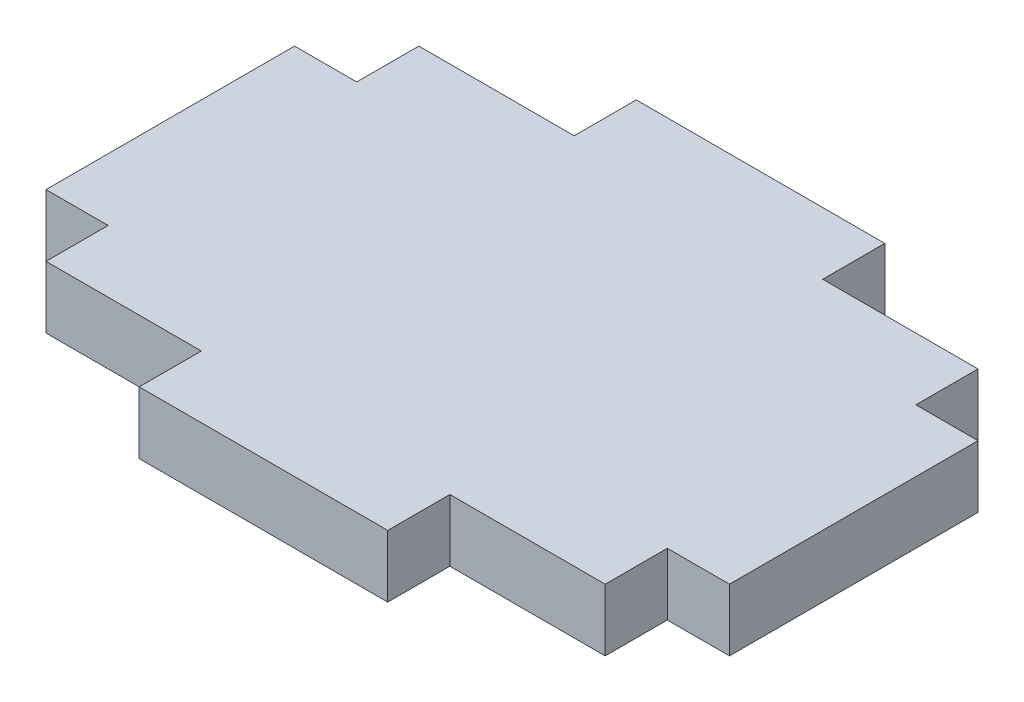
ISO-10303-21;
HEADER;
FILE_DESCRIPTION(('STEP AP214'),'2;1');
FILE_NAME('part.step','',(''),(''),'','','');
FILE_SCHEMA(('AUTOMOTIVE_DESIGN { 1 0 10303 214 1 1 1 1 }'));
ENDSEC;
DATA;
#1=APPLICATION_CONTEXT('core data for automotive mechanical design processes');
#2=APPLICATION_PROTOCOL_DEFINITION('international standard','automotive_design',2000,#1);
#3=PRODUCT_CONTEXT('',#1,'mechanical');
#4=PRODUCT('Part','Part','',(#3));
#5=PRODUCT_RELATED_PRODUCT_CATEGORY('part','',(#4));
#6=PRODUCT_DEFINITION_FORMATION('','',#4);
#7=PRODUCT_DEFINITION_CONTEXT('part definition',#1,'design');
#8=PRODUCT_DEFINITION('design','',#6,#7);
#9=PRODUCT_DEFINITION_SHAPE('','',#8);
#10=(LENGTH_UNIT() NAMED_UNIT(*) SI_UNIT(.MILLI.,.METRE.));
#11=(NAMED_UNIT(*) PLANE_ANGLE_UNIT() SI_UNIT($,.RADIAN.));
#12=(NAMED_UNIT(*) SI_UNIT($,.STERADIAN.) SOLID_ANGLE_UNIT());
#13=UNCERTAINTY_MEASURE_WITH_UNIT(LENGTH_MEASURE(1.E-05),#10,'distance_accuracy_value','');
#14=(GEOMETRIC_REPRESENTATION_CONTEXT(3) GLOBAL_UNCERTAINTY_ASSIGNED_CONTEXT((#13)) GLOBAL_UNIT_ASSIGNED_CONTEXT((#10,
#11,#12)) REPRESENTATION_CONTEXT('',''));
#15=CARTESIAN_POINT('',(0.,0.,0.));
#16=DIRECTION('',(0.,0.,1.));
#17=DIRECTION('',(1.,0.,0.));
#18=AXIS2_PLACEMENT_3D('',#15,#16,#17);
#19=CARTESIAN_POINT('',(0.,10.,0.));
#20=DIRECTION('',(-1.,0.,0.));
#21=DIRECTION('',(0.,0.,1.));
#22=AXIS2_PLACEMENT_3D('',#19,#20,#21);
#23=PLANE('',#22);
#24=DIRECTION('',(0.,0.,-1.));
#25=VECTOR('',#24,1.);
#26=CARTESIAN_POINT('',(0.,0.,0.));
#27=LINE('',#26,#25);
#28=CARTESIAN_POINT('',(0.,0.,0.));
#29=VERTEX_POINT('',#28);
#30=CARTESIAN_POINT('',(0.,0.,-10.));
#31=VERTEX_POINT('',#30);
#32=EDGE_CURVE('E185',#29,#31,#27,.T.);
#33=ORIENTED_EDGE('',*,*,#32,.F.);
#34=DIRECTION('',(0.,-1.,0.));
#35=VECTOR('',#34,1.);
#36=CARTESIAN_POINT('',(0.,10.,0.));
#37=LINE('',#36,#35);
#38=CARTESIAN_POINT('',(0.,10.,0.));
#39=VERTEX_POINT('',#38);
#40=EDGE_CURVE('E194',#39,#29,#37,.T.);
#41=ORIENTED_EDGE('',*,*,#40,.F.);
#42=DIRECTION('',(0.,0.,-1.));
#43=VECTOR('',#42,1.);
#44=CARTESIAN_POINT('',(0.,10.,0.));
#45=LINE('',#44,#43);
#46=CARTESIAN_POINT('',(0.,10.,-10.));
#47=VERTEX_POINT('',#46);
#48=EDGE_CURVE('E146',#39,#47,#45,.T.);
#49=ORIENTED_EDGE('',*,*,#48,.T.);
#50=DIRECTION('',(0.,-1.,0.));
#51=VECTOR('',#50,1.);
#52=CARTESIAN_POINT('',(0.,10.,-10.));
#53=LINE('',#52,#51);
#54=EDGE_CURVE('E197',#47,#31,#53,.T.);
#55=ORIENTED_EDGE('',*,*,#54,.T.);
#56=EDGE_LOOP('',(#33,#41,#49,#55));
#57=FACE_BOUND('',#56,.T.);
#58=ADVANCED_FACE('F35',(#57),#23,.T.);
#59=CARTESIAN_POINT('',(0.,10.,-10.));
#60=DIRECTION('',(0.,0.,1.));
#61=DIRECTION('',(1.,0.,0.));
#62=AXIS2_PLACEMENT_3D('',#59,#60,#61);
#63=PLANE('',#62);
#64=DIRECTION('',(-1.,0.,0.));
#65=VECTOR('',#64,1.);
#66=CARTESIAN_POINT('',(0.,0.,-10.));
#67=LINE('',#66,#65);
#68=CARTESIAN_POINT('',(-10.,0.,-9.99999999999999));
#69=VERTEX_POINT('',#68);
#70=EDGE_CURVE('E191',#31,#69,#67,.T.);
#71=ORIENTED_EDGE('',*,*,#70,.F.);
#72=ORIENTED_EDGE('',*,*,#54,.F.);
#73=DIRECTION('',(-1.,0.,0.));
#74=VECTOR('',#73,1.);
#75=CARTESIAN_POINT('',(0.,10.,-10.));
#76=LINE('',#75,#74);
#77=CARTESIAN_POINT('',(-10.,10.,-9.99999999999999));
#78=VERTEX_POINT('',#77);
#79=EDGE_CURVE('E152',#47,#78,#76,.T.);
#80=ORIENTED_EDGE('',*,*,#79,.T.);
#81=DIRECTION('',(0.,-1.,0.));
#82=VECTOR('',#81,1.);
#83=CARTESIAN_POINT('',(-10.,10.,-9.99999999999999));
#84=LINE('',#83,#82);
#85=EDGE_CURVE('E200',#78,#69,#84,.T.);
#86=ORIENTED_EDGE('',*,*,#85,.T.);
#87=EDGE_LOOP('',(#71,#72,#80,#86));
#88=FACE_BOUND('',#87,.T.);
#89=ADVANCED_FACE('F372',(#88),#63,.T.);
#90=CARTESIAN_POINT('',(-9.99999999999999,10.,0.));
#91=DIRECTION('',(1.,0.,0.));
#92=DIRECTION('',(0.,0.,-1.));
#93=AXIS2_PLACEMENT_3D('',#90,#91,#92);
#94=PLANE('',#93);
#95=DIRECTION('',(0.,0.,1.));
#96=VECTOR('',#95,1.);
#97=CARTESIAN_POINT('',(-9.99999999999999,0.,0.));
#98=LINE('',#97,#96);
#99=CARTESIAN_POINT('',(-10.,0.,-50.));
#100=VERTEX_POINT('',#99);
#101=EDGE_CURVE('E188',#100,#69,#98,.T.);
#102=ORIENTED_EDGE('',*,*,#101,.T.);
#103=ORIENTED_EDGE('',*,*,#85,.F.);
#104=DIRECTION('',(0.,0.,1.));
#105=VECTOR('',#104,1.);
#106=CARTESIAN_POINT('',(-9.99999999999999,10.,0.));
#107=LINE('',#106,#105);
#108=CARTESIAN_POINT('',(-10.,10.,-50.));
#109=VERTEX_POINT('',#108);
#110=EDGE_CURVE('E149',#109,#78,#107,.T.);
#111=ORIENTED_EDGE('',*,*,#110,.F.);
#112=DIRECTION('',(0.,-1.,0.));
#113=VECTOR('',#112,1.);
#114=CARTESIAN_POINT('',(-10.,10.,-50.));
#115=LINE('',#114,#113);
#116=EDGE_CURVE('E203',#109,#100,#115,.T.);
#117=ORIENTED_EDGE('',*,*,#116,.T.);
#118=EDGE_LOOP('',(#102,#103,#111,#117));
#119=FACE_BOUND('',#118,.T.);
#120=ADVANCED_FACE('F379',(#119),#94,.F.);
#121=CARTESIAN_POINT('',(0.,10.,-50.));
#122=DIRECTION('',(0.,0.,1.));
#123=DIRECTION('',(1.,0.,0.));
#124=AXIS2_PLACEMENT_3D('',#121,#122,#123);
#125=PLANE('',#124);
#126=DIRECTION('',(-1.,0.,0.));
#127=VECTOR('',#126,1.);
#128=CARTESIAN_POINT('',(0.,0.,-50.));
#129=LINE('',#128,#127);
#130=CARTESIAN_POINT('',(0.,0.,-50.));
#131=VERTEX_POINT('',#130);
#132=EDGE_CURVE('E184',#131,#100,#129,.T.);
#133=ORIENTED_EDGE('',*,*,#132,.T.);
#134=ORIENTED_EDGE('',*,*,#116,.F.);
#135=DIRECTION('',(-1.,0.,0.));
#136=VECTOR('',#135,1.);
#137=CARTESIAN_POINT('',(0.,10.,-50.));
#138=LINE('',#137,#136);
#139=CARTESIAN_POINT('',(0.,10.,-50.));
#140=VERTEX_POINT('',#139);
#141=EDGE_CURVE('E145',#140,#109,#138,.T.);
#142=ORIENTED_EDGE('',*,*,#141,.F.);
#143=DIRECTION('',(0.,-1.,0.));
#144=VECTOR('',#143,1.);
#145=CARTESIAN_POINT('',(0.,10.,-50.));
#146=LINE('',#145,#144);
#147=EDGE_CURVE('E206',#140,#131,#146,.T.);
#148=ORIENTED_EDGE('',*,*,#147,.T.);
#149=EDGE_LOOP('',(#133,#134,#142,#148));
#150=FACE_BOUND('',#149,.T.);
#151=ADVANCED_FACE('F397',(#150),#125,.F.);
#152=CARTESIAN_POINT('',(0.,10.,-50.));
#153=DIRECTION('',(0.,0.,-1.));
#154=DIRECTION('',(-1.,0.,0.));
#155=AXIS2_PLACEMENT_3D('',#152,#153,#154);
#156=PLANE('',#155);
#157=DIRECTION('',(1.,0.,0.));
#158=VECTOR('',#157,1.);
#159=CARTESIAN_POINT('',(0.,0.,-50.));
#160=LINE('',#159,#158);
#161=CARTESIAN_POINT('',(90.,0.,-50.));
#162=VERTEX_POINT('',#161);
#163=CARTESIAN_POINT('',(100.,0.,-50.));
#164=VERTEX_POINT('',#163);
#165=EDGE_CURVE('E175',#162,#164,#160,.T.);
#166=ORIENTED_EDGE('',*,*,#165,.F.);
#167=DIRECTION('',(0.,-1.,0.));
#168=VECTOR('',#167,1.);
#169=CARTESIAN_POINT('',(90.,10.,-50.));
#170=LINE('',#169,#168);
#171=CARTESIAN_POINT('',(90.,10.,-50.));
#172=VERTEX_POINT('',#171);
#173=EDGE_CURVE('E214',#172,#162,#170,.T.);
#174=ORIENTED_EDGE('',*,*,#173,.F.);
#175=DIRECTION('',(1.,0.,0.));
#176=VECTOR('',#175,1.);
#177=CARTESIAN_POINT('',(0.,10.,-50.));
#178=LINE('',#177,#176);
#179=CARTESIAN_POINT('',(100.,10.,-50.));
#180=VERTEX_POINT('',#179);
#181=EDGE_CURVE('E137',#172,#180,#178,.T.);
#182=ORIENTED_EDGE('',*,*,#181,.T.);
#183=DIRECTION('',(0.,-1.,0.));
#184=VECTOR('',#183,1.);
#185=CARTESIAN_POINT('',(100.,10.,-50.));
#186=LINE('',#185,#184);
#187=EDGE_CURVE('E217',#180,#164,#186,.T.);
#188=ORIENTED_EDGE('',*,*,#187,.T.);
#189=EDGE_LOOP('',(#166,#174,#182,#188));
#190=FACE_BOUND('',#189,.T.);
#191=ADVANCED_FACE('F294',(#190),#156,.T.);
#192=CARTESIAN_POINT('',(100.,10.,0.));
#193=DIRECTION('',(1.,0.,0.));
#194=DIRECTION('',(0.,0.,-1.));
#195=AXIS2_PLACEMENT_3D('',#192,#193,#194);
#196=PLANE('',#195);
#197=DIRECTION('',(0.,0.,1.));
#198=VECTOR('',#197,1.);
#199=CARTESIAN_POINT('',(100.,0.,0.));
#200=LINE('',#199,#198);
#201=CARTESIAN_POINT('',(100.,0.,-9.99999999999999));
#202=VERTEX_POINT('',#201);
#203=EDGE_CURVE('E172',#164,#202,#200,.T.);
#204=ORIENTED_EDGE('',*,*,#203,.F.);
#205=ORIENTED_EDGE('',*,*,#187,.F.);
#206=DIRECTION('',(0.,0.,1.));
#207=VECTOR('',#206,1.);
#208=CARTESIAN_POINT('',(100.,10.,0.));
#209=LINE('',#208,#207);
#210=CARTESIAN_POINT('',(100.,10.,-9.99999999999999));
#211=VERTEX_POINT('',#210);
#212=EDGE_CURVE('E278',#180,#211,#209,.T.);
#213=ORIENTED_EDGE('',*,*,#212,.T.);
#214=DIRECTION('',(0.,-1.,0.));
#215=VECTOR('',#214,1.);
#216=CARTESIAN_POINT('',(100.,10.,-9.99999999999999));
#217=LINE('',#216,#215);
#218=EDGE_CURVE('E220',#211,#202,#217,.T.);
#219=ORIENTED_EDGE('',*,*,#218,.T.);
#220=EDGE_LOOP('',(#204,#205,#213,#219));
#221=FACE_BOUND('',#220,.T.);
#222=ADVANCED_FACE('F355',(#221),#196,.T.);
#223=CARTESIAN_POINT('',(0.,10.,-9.99999999999999));
#224=DIRECTION('',(0.,0.,-1.));
#225=DIRECTION('',(-1.,0.,0.));
#226=AXIS2_PLACEMENT_3D('',#223,#224,#225);
#227=PLANE('',#226);
#228=DIRECTION('',(1.,0.,0.));
#229=VECTOR('',#228,1.);
#230=CARTESIAN_POINT('',(0.,0.,-9.99999999999999));
#231=LINE('',#230,#229);
#232=CARTESIAN_POINT('',(90.,0.,-9.99999999999999));
#233=VERTEX_POINT('',#232);
#234=EDGE_CURVE('E168',#233,#202,#231,.T.);
#235=ORIENTED_EDGE('',*,*,#234,.T.);
#236=ORIENTED_EDGE('',*,*,#218,.F.);
#237=DIRECTION('',(1.,0.,0.));
#238=VECTOR('',#237,1.);
#239=CARTESIAN_POINT('',(0.,10.,-9.99999999999999));
#240=LINE('',#239,#238);
#241=CARTESIAN_POINT('',(90.,10.,-9.99999999999999));
#242=VERTEX_POINT('',#241);
#243=EDGE_CURVE('E276',#242,#211,#240,.T.);
#244=ORIENTED_EDGE('',*,*,#243,.F.);
#245=DIRECTION('',(0.,-1.,0.));
#246=VECTOR('',#245,1.);
#247=CARTESIAN_POINT('',(90.,10.,-9.99999999999999));
#248=LINE('',#247,#246);
#249=EDGE_CURVE('E223',#242,#233,#248,.T.);
#250=ORIENTED_EDGE('',*,*,#249,.T.);
#251=EDGE_LOOP('',(#235,#236,#244,#250));
#252=FACE_BOUND('',#251,.T.);
#253=ADVANCED_FACE('F354',(#252),#227,.F.);
#254=CARTESIAN_POINT('',(90.,10.,0.));
#255=DIRECTION('',(-1.,0.,0.));
#256=DIRECTION('',(0.,0.,1.));
#257=AXIS2_PLACEMENT_3D('',#254,#255,#256);
#258=PLANE('',#257);
#259=DIRECTION('',(0.,0.,-1.));
#260=VECTOR('',#259,1.);
#261=CARTESIAN_POINT('',(90.,0.,0.));
#262=LINE('',#261,#260);
#263=CARTESIAN_POINT('',(90.,0.,0.));
#264=VERTEX_POINT('',#263);
#265=EDGE_CURVE('E165',#264,#233,#262,.T.);
#266=ORIENTED_EDGE('',*,*,#265,.T.);
#267=ORIENTED_EDGE('',*,*,#249,.F.);
#268=DIRECTION('',(0.,0.,-1.));
#269=VECTOR('',#268,1.);
#270=CARTESIAN_POINT('',(90.,10.,0.));
#271=LINE('',#270,#269);
#272=CARTESIAN_POINT('',(90.,10.,0.));
#273=VERTEX_POINT('',#272);
#274=EDGE_CURVE('E139',#273,#242,#271,.T.);
#275=ORIENTED_EDGE('',*,*,#274,.F.);
#276=DIRECTION('',(0.,-1.,0.));
#277=VECTOR('',#276,1.);
#278=CARTESIAN_POINT('',(90.,10.,0.));
#279=LINE('',#278,#277);
#280=EDGE_CURVE('E226',#273,#264,#279,.T.);
#281=ORIENTED_EDGE('',*,*,#280,.T.);
#282=EDGE_LOOP('',(#266,#267,#275,#281));
#283=FACE_BOUND('',#282,.T.);
#284=ADVANCED_FACE('F267',(#283),#258,.F.);
#285=CARTESIAN_POINT('',(0.,10.,0.));
#286=DIRECTION('',(0.,0.,-1.));
#287=DIRECTION('',(-1.,0.,0.));
#288=AXIS2_PLACEMENT_3D('',#285,#286,#287);
#289=PLANE('',#288);
#290=DIRECTION('',(1.,0.,0.));
#291=VECTOR('',#290,1.);
#292=CARTESIAN_POINT('',(0.,0.,0.));
#293=LINE('',#292,#291);
#294=CARTESIAN_POINT('',(65.,0.,0.));
#295=VERTEX_POINT('',#294);
#296=EDGE_CURVE('E157',#295,#264,#293,.T.);
#297=ORIENTED_EDGE('',*,*,#296,.T.);
#298=ORIENTED_EDGE('',*,*,#280,.F.);
#299=DIRECTION('',(1.,0.,0.));
#300=VECTOR('',#299,1.);
#301=CARTESIAN_POINT('',(0.,10.,0.));
#302=LINE('',#301,#300);
#303=CARTESIAN_POINT('',(65.,10.,0.));
#304=VERTEX_POINT('',#303);
#305=EDGE_CURVE('E277',#304,#273,#302,.T.);
#306=ORIENTED_EDGE('',*,*,#305,.F.);
#307=DIRECTION('',(0.,-1.,0.));
#308=VECTOR('',#307,1.);
#309=CARTESIAN_POINT('',(65.,10.,0.));
#310=LINE('',#309,#308);
#311=EDGE_CURVE('E229',#304,#295,#310,.T.);
#312=ORIENTED_EDGE('',*,*,#311,.T.);
#313=EDGE_LOOP('',(#297,#298,#306,#312));
#314=FACE_BOUND('',#313,.T.);
#315=ADVANCED_FACE('F260',(#314),#289,.F.);
#316=CARTESIAN_POINT('',(65.,10.,0.));
#317=DIRECTION('',(1.,0.,0.));
#318=DIRECTION('',(0.,0.,-1.));
#319=AXIS2_PLACEMENT_3D('',#316,#317,#318);
#320=PLANE('',#319);
#321=DIRECTION('',(0.,0.,1.));
#322=VECTOR('',#321,1.);
#323=CARTESIAN_POINT('',(65.,0.,0.));
#324=LINE('',#323,#322);
#325=CARTESIAN_POINT('',(65.,0.,10.));
#326=VERTEX_POINT('',#325);
#327=EDGE_CURVE('E162',#295,#326,#324,.T.);
#328=ORIENTED_EDGE('',*,*,#327,.F.);
#329=ORIENTED_EDGE('',*,*,#311,.F.);
#330=DIRECTION('',(0.,0.,1.));
#331=VECTOR('',#330,1.);
#332=CARTESIAN_POINT('',(65.,10.,0.));
#333=LINE('',#332,#331);
#334=CARTESIAN_POINT('',(65.,10.,10.));
#335=VERTEX_POINT('',#334);
#336=EDGE_CURVE('E243',#304,#335,#333,.T.);
#337=ORIENTED_EDGE('',*,*,#336,.T.);
#338=DIRECTION('',(0.,-1.,0.));
#339=VECTOR('',#338,1.);
#340=CARTESIAN_POINT('',(65.,10.,10.));
#341=LINE('',#340,#339);
#342=EDGE_CURVE('E115',#335,#326,#341,.T.);
#343=ORIENTED_EDGE('',*,*,#342,.T.);
#344=EDGE_LOOP('',(#328,#329,#337,#343));
#345=FACE_BOUND('',#344,.T.);
#346=ADVANCED_FACE('F238',(#345),#320,.T.);
#347=CARTESIAN_POINT('',(0.,10.,10.));
#348=DIRECTION('',(0.,0.,1.));
#349=DIRECTION('',(1.,0.,0.));
#350=AXIS2_PLACEMENT_3D('',#347,#348,#349);
#351=PLANE('',#350);
#352=DIRECTION('',(-1.,0.,0.));
#353=VECTOR('',#352,1.);
#354=CARTESIAN_POINT('',(0.,0.,10.));
#355=LINE('',#354,#353);
#356=CARTESIAN_POINT('',(25.,0.,10.));
#357=VERTEX_POINT('',#356);
#358=EDGE_CURVE('E159',#326,#357,#355,.T.);
#359=ORIENTED_EDGE('',*,*,#358,.F.);
#360=ORIENTED_EDGE('',*,*,#342,.F.);
#361=DIRECTION('',(-1.,0.,0.));
#362=VECTOR('',#361,1.);
#363=CARTESIAN_POINT('',(0.,10.,10.));
#364=LINE('',#363,#362);
#365=CARTESIAN_POINT('',(25.,10.,10.));
#366=VERTEX_POINT('',#365);
#367=EDGE_CURVE('E408',#335,#366,#364,.T.);
#368=ORIENTED_EDGE('',*,*,#367,.T.);
#369=DIRECTION('',(0.,-1.,0.));
#370=VECTOR('',#369,1.);
#371=CARTESIAN_POINT('',(25.,10.,10.));
#372=LINE('',#371,#370);
#373=EDGE_CURVE('E107',#366,#357,#372,.T.);
#374=ORIENTED_EDGE('',*,*,#373,.T.);
#375=EDGE_LOOP('',(#359,#360,#368,#374));
#376=FACE_BOUND('',#375,.T.);
#377=ADVANCED_FACE('F249',(#376),#351,.T.);
#378=CARTESIAN_POINT('',(25.,10.,0.));
#379=DIRECTION('',(1.,0.,0.));
#380=DIRECTION('',(0.,0.,-1.));
#381=AXIS2_PLACEMENT_3D('',#378,#379,#380);
#382=PLANE('',#381);
#383=DIRECTION('',(0.,0.,1.));
#384=VECTOR('',#383,1.);
#385=CARTESIAN_POINT('',(25.,0.,0.));
#386=LINE('',#385,#384);
#387=CARTESIAN_POINT('',(25.,0.,0.));
#388=VERTEX_POINT('',#387);
#389=EDGE_CURVE('E156',#388,#357,#386,.T.);
#390=ORIENTED_EDGE('',*,*,#389,.T.);
#391=ORIENTED_EDGE('',*,*,#373,.F.);
#392=DIRECTION('',(0.,0.,1.));
#393=VECTOR('',#392,1.);
#394=CARTESIAN_POINT('',(25.,10.,0.));
#395=LINE('',#394,#393);
#396=CARTESIAN_POINT('',(25.,10.,0.));
#397=VERTEX_POINT('',#396);
#398=EDGE_CURVE('E347',#397,#366,#395,.T.);
#399=ORIENTED_EDGE('',*,*,#398,.F.);
#400=DIRECTION('',(0.,-1.,0.));
#401=VECTOR('',#400,1.);
#402=CARTESIAN_POINT('',(25.,10.,0.));
#403=LINE('',#402,#401);
#404=EDGE_CURVE('E101',#397,#388,#403,.T.);
#405=ORIENTED_EDGE('',*,*,#404,.T.);
#406=EDGE_LOOP('',(#390,#391,#399,#405));
#407=FACE_BOUND('',#406,.T.);
#408=ADVANCED_FACE('F410',(#407),#382,.F.);
#409=EDGE_CURVE('E84',#29,#388,#293,.T.);
#410=ORIENTED_EDGE('',*,*,#409,.T.);
#411=ORIENTED_EDGE('',*,*,#404,.F.);
#412=EDGE_CURVE('E281',#39,#397,#302,.T.);
#413=ORIENTED_EDGE('',*,*,#412,.F.);
#414=ORIENTED_EDGE('',*,*,#40,.T.);
#415=EDGE_LOOP('',(#410,#411,#413,#414));
#416=FACE_BOUND('',#415,.T.);
#417=ADVANCED_FACE('F390',(#416),#289,.F.);
#418=CARTESIAN_POINT('',(90.,0.,-60.));
#419=VERTEX_POINT('',#418);
#420=EDGE_CURVE('E169',#162,#419,#262,.T.);
#421=ORIENTED_EDGE('',*,*,#420,.T.);
#422=DIRECTION('',(0.,-1.,0.));
#423=VECTOR('',#422,1.);
#424=CARTESIAN_POINT('',(90.,10.,-60.));
#425=LINE('',#424,#423);
#426=CARTESIAN_POINT('',(90.,10.,-60.));
#427=VERTEX_POINT('',#426);
#428=EDGE_CURVE('E212',#427,#419,#425,.T.);
#429=ORIENTED_EDGE('',*,*,#428,.F.);
#430=EDGE_CURVE('E131',#172,#427,#271,.T.);
#431=ORIENTED_EDGE('',*,*,#430,.F.);
#432=ORIENTED_EDGE('',*,*,#173,.T.);
#433=EDGE_LOOP('',(#421,#429,#431,#432));
#434=FACE_BOUND('',#433,.T.);
#435=ADVANCED_FACE('F359',(#434),#258,.F.);
#436=CARTESIAN_POINT('',(0.,0.,-60.));
#437=VERTEX_POINT('',#436);
#438=EDGE_CURVE('E180',#131,#437,#27,.T.);
#439=ORIENTED_EDGE('',*,*,#438,.F.);
#440=ORIENTED_EDGE('',*,*,#147,.F.);
#441=CARTESIAN_POINT('',(0.,10.,-60.));
#442=VERTEX_POINT('',#441);
#443=EDGE_CURVE('E136',#140,#442,#45,.T.);
#444=ORIENTED_EDGE('',*,*,#443,.T.);
#445=DIRECTION('',(0.,-1.,0.));
#446=VECTOR('',#445,1.);
#447=CARTESIAN_POINT('',(0.,10.,-60.));
#448=LINE('',#447,#446);
#449=EDGE_CURVE('E209',#442,#437,#448,.T.);
#450=ORIENTED_EDGE('',*,*,#449,.T.);
#451=EDGE_LOOP('',(#439,#440,#444,#450));
#452=FACE_BOUND('',#451,.T.);
#453=ADVANCED_FACE('F375',(#452),#23,.T.);
#454=CARTESIAN_POINT('',(0.,0.,0.));
#455=DIRECTION('',(0.,1.,0.));
#456=DIRECTION('',(0.,0.,1.));
#457=AXIS2_PLACEMENT_3D('',#454,#455,#456);
#458=PLANE('',#457);
#459=ORIENTED_EDGE('',*,*,#409,.F.);
#460=ORIENTED_EDGE('',*,*,#32,.T.);
#461=ORIENTED_EDGE('',*,*,#70,.T.);
#462=ORIENTED_EDGE('',*,*,#101,.F.);
#463=ORIENTED_EDGE('',*,*,#132,.F.);
#464=ORIENTED_EDGE('',*,*,#438,.T.);
#465=DIRECTION('',(1.,0.,0.));
#466=VECTOR('',#465,1.);
#467=CARTESIAN_POINT('',(0.,0.,-60.));
#468=LINE('',#467,#466);
#469=CARTESIAN_POINT('',(25.,0.,-60.));
#470=VERTEX_POINT('',#469);
#471=EDGE_CURVE('E178',#437,#470,#468,.T.);
#472=ORIENTED_EDGE('',*,*,#471,.T.);
#473=DIRECTION('',(0.,0.,-1.));
#474=VECTOR('',#473,1.);
#475=CARTESIAN_POINT('',(25.,0.,-60.));
#476=LINE('',#475,#474);
#477=CARTESIAN_POINT('',(25.,0.,-70.));
#478=VERTEX_POINT('',#477);
#479=EDGE_CURVE('E95',#470,#478,#476,.T.);
#480=ORIENTED_EDGE('',*,*,#479,.T.);
#481=DIRECTION('',(1.,0.,0.));
#482=VECTOR('',#481,1.);
#483=CARTESIAN_POINT('',(25.,0.,-70.));
#484=LINE('',#483,#482);
#485=CARTESIAN_POINT('',(65.,0.,-70.));
#486=VERTEX_POINT('',#485);
#487=EDGE_CURVE('E79',#478,#486,#484,.T.);
#488=ORIENTED_EDGE('',*,*,#487,.T.);
#489=DIRECTION('',(0.,0.,-1.));
#490=VECTOR('',#489,1.);
#491=CARTESIAN_POINT('',(65.,0.,-60.));
#492=LINE('',#491,#490);
#493=CARTESIAN_POINT('',(65.,0.,-60.));
#494=VERTEX_POINT('',#493);
#495=EDGE_CURVE('E86',#494,#486,#492,.T.);
#496=ORIENTED_EDGE('',*,*,#495,.F.);
#497=EDGE_CURVE('E181',#494,#419,#468,.T.);
#498=ORIENTED_EDGE('',*,*,#497,.T.);
#499=ORIENTED_EDGE('',*,*,#420,.F.);
#500=ORIENTED_EDGE('',*,*,#165,.T.);
#501=ORIENTED_EDGE('',*,*,#203,.T.);
#502=ORIENTED_EDGE('',*,*,#234,.F.);
#503=ORIENTED_EDGE('',*,*,#265,.F.);
#504=ORIENTED_EDGE('',*,*,#296,.F.);
#505=ORIENTED_EDGE('',*,*,#327,.T.);
#506=ORIENTED_EDGE('',*,*,#358,.T.);
#507=ORIENTED_EDGE('',*,*,#389,.F.);
#508=EDGE_LOOP('',(#459,#460,#461,#462,#463,#464,#472,#480,#488,#496,#498,#499,#500,#501,#502,
#503,#504,#505,#506,#507));
#509=FACE_BOUND('',#508,.T.);
#510=ADVANCED_FACE('F93',(#509),#458,.F.);
#511=CARTESIAN_POINT('',(0.,10.,0.));
#512=DIRECTION('',(0.,1.,0.));
#513=DIRECTION('',(0.,0.,1.));
#514=AXIS2_PLACEMENT_3D('',#511,#512,#513);
#515=PLANE('',#514);
#516=ORIENTED_EDGE('',*,*,#412,.T.);
#517=ORIENTED_EDGE('',*,*,#398,.T.);
#518=ORIENTED_EDGE('',*,*,#367,.F.);
#519=ORIENTED_EDGE('',*,*,#336,.F.);
#520=ORIENTED_EDGE('',*,*,#305,.T.);
#521=ORIENTED_EDGE('',*,*,#274,.T.);
#522=ORIENTED_EDGE('',*,*,#243,.T.);
#523=ORIENTED_EDGE('',*,*,#212,.F.);
#524=ORIENTED_EDGE('',*,*,#181,.F.);
#525=ORIENTED_EDGE('',*,*,#430,.T.);
#526=DIRECTION('',(1.,0.,0.));
#527=VECTOR('',#526,1.);
#528=CARTESIAN_POINT('',(0.,10.,-60.));
#529=LINE('',#528,#527);
#530=CARTESIAN_POINT('',(65.,10.,-60.));
#531=VERTEX_POINT('',#530);
#532=EDGE_CURVE('E127',#531,#427,#529,.T.);
#533=ORIENTED_EDGE('',*,*,#532,.F.);
#534=DIRECTION('',(0.,0.,-1.));
#535=VECTOR('',#534,1.);
#536=CARTESIAN_POINT('',(65.,10.,-60.));
#537=LINE('',#536,#535);
#538=CARTESIAN_POINT('',(65.,10.,-70.));
#539=VERTEX_POINT('',#538);
#540=EDGE_CURVE('E120',#531,#539,#537,.T.);
#541=ORIENTED_EDGE('',*,*,#540,.T.);
#542=DIRECTION('',(1.,0.,0.));
#543=VECTOR('',#542,1.);
#544=CARTESIAN_POINT('',(25.,10.,-70.));
#545=LINE('',#544,#543);
#546=CARTESIAN_POINT('',(25.,10.,-70.));
#547=VERTEX_POINT('',#546);
#548=EDGE_CURVE('E82',#547,#539,#545,.T.);
#549=ORIENTED_EDGE('',*,*,#548,.F.);
#550=DIRECTION('',(0.,0.,-1.));
#551=VECTOR('',#550,1.);
#552=CARTESIAN_POINT('',(25.,10.,-60.));
#553=LINE('',#552,#551);
#554=CARTESIAN_POINT('',(25.,10.,-60.));
#555=VERTEX_POINT('',#554);
#556=EDGE_CURVE('E90',#555,#547,#553,.T.);
#557=ORIENTED_EDGE('',*,*,#556,.F.);
#558=EDGE_CURVE('E134',#442,#555,#529,.T.);
#559=ORIENTED_EDGE('',*,*,#558,.F.);
#560=ORIENTED_EDGE('',*,*,#443,.F.);
#561=ORIENTED_EDGE('',*,*,#141,.T.);
#562=ORIENTED_EDGE('',*,*,#110,.T.);
#563=ORIENTED_EDGE('',*,*,#79,.F.);
#564=ORIENTED_EDGE('',*,*,#48,.F.);
#565=EDGE_LOOP('',(#516,#517,#518,#519,#520,#521,#522,#523,#524,#525,#533,#541,#549,#557,#559,
#560,#561,#562,#563,#564));
#566=FACE_BOUND('',#565,.T.);
#567=ADVANCED_FACE('F124',(#566),#515,.T.);
#568=CARTESIAN_POINT('',(0.,10.,-60.));
#569=DIRECTION('',(0.,0.,-1.));
#570=DIRECTION('',(-1.,0.,0.));
#571=AXIS2_PLACEMENT_3D('',#568,#569,#570);
#572=PLANE('',#571);
#573=ORIENTED_EDGE('',*,*,#558,.T.);
#574=DIRECTION('',(0.,-1.,0.));
#575=VECTOR('',#574,1.);
#576=CARTESIAN_POINT('',(25.,10.,-60.));
#577=LINE('',#576,#575);
#578=EDGE_CURVE('E45',#555,#470,#577,.T.);
#579=ORIENTED_EDGE('',*,*,#578,.T.);
#580=ORIENTED_EDGE('',*,*,#471,.F.);
#581=ORIENTED_EDGE('',*,*,#449,.F.);
#582=EDGE_LOOP('',(#573,#579,#580,#581));
#583=FACE_BOUND('',#582,.T.);
#584=ADVANCED_FACE('F362',(#583),#572,.T.);
#585=DIRECTION('',(0.,-1.,0.));
#586=VECTOR('',#585,1.);
#587=CARTESIAN_POINT('',(65.,10.,-60.));
#588=LINE('',#587,#586);
#589=EDGE_CURVE('E11',#531,#494,#588,.T.);
#590=ORIENTED_EDGE('',*,*,#589,.F.);
#591=ORIENTED_EDGE('',*,*,#532,.T.);
#592=ORIENTED_EDGE('',*,*,#428,.T.);
#593=ORIENTED_EDGE('',*,*,#497,.F.);
#594=EDGE_LOOP('',(#590,#591,#592,#593));
#595=FACE_BOUND('',#594,.T.);
#596=ADVANCED_FACE('F360',(#595),#572,.T.);
#597=CARTESIAN_POINT('',(25.,10.,-70.));
#598=DIRECTION('',(0.,0.,-1.));
#599=DIRECTION('',(-1.,0.,0.));
#600=AXIS2_PLACEMENT_3D('',#597,#598,#599);
#601=PLANE('',#600);
#602=ORIENTED_EDGE('',*,*,#487,.F.);
#603=DIRECTION('',(0.,-1.,0.));
#604=VECTOR('',#603,1.);
#605=CARTESIAN_POINT('',(25.,10.,-70.));
#606=LINE('',#605,#604);
#607=EDGE_CURVE('E39',#547,#478,#606,.T.);
#608=ORIENTED_EDGE('',*,*,#607,.F.);
#609=ORIENTED_EDGE('',*,*,#548,.T.);
#610=DIRECTION('',(0.,-1.,0.));
#611=VECTOR('',#610,1.);
#612=CARTESIAN_POINT('',(65.,10.,-70.));
#613=LINE('',#612,#611);
#614=EDGE_CURVE('E75',#539,#486,#613,.T.);
#615=ORIENTED_EDGE('',*,*,#614,.T.);
#616=EDGE_LOOP('',(#602,#608,#609,#615));
#617=FACE_BOUND('',#616,.T.);
#618=ADVANCED_FACE('F77',(#617),#601,.T.);
#619=CARTESIAN_POINT('',(25.,10.,-60.));
#620=DIRECTION('',(-1.,0.,0.));
#621=DIRECTION('',(0.,0.,1.));
#622=AXIS2_PLACEMENT_3D('',#619,#620,#621);
#623=PLANE('',#622);
#624=ORIENTED_EDGE('',*,*,#479,.F.);
#625=ORIENTED_EDGE('',*,*,#578,.F.);
#626=ORIENTED_EDGE('',*,*,#556,.T.);
#627=ORIENTED_EDGE('',*,*,#607,.T.);
#628=EDGE_LOOP('',(#624,#625,#626,#627));
#629=FACE_BOUND('',#628,.T.);
#630=ADVANCED_FACE('F37',(#629),#623,.T.);
#631=CARTESIAN_POINT('',(65.,10.,-60.));
#632=DIRECTION('',(-1.,0.,0.));
#633=DIRECTION('',(0.,0.,1.));
#634=AXIS2_PLACEMENT_3D('',#631,#632,#633);
#635=PLANE('',#634);
#636=ORIENTED_EDGE('',*,*,#495,.T.);
#637=ORIENTED_EDGE('',*,*,#614,.F.);
#638=ORIENTED_EDGE('',*,*,#540,.F.);
#639=ORIENTED_EDGE('',*,*,#589,.T.);
#640=EDGE_LOOP('',(#636,#637,#638,#639));
#641=FACE_BOUND('',#640,.T.);
#642=ADVANCED_FACE('F87',(#641),#635,.F.);
#643=CLOSED_SHELL('',(#58,#89,#120,#151,#191,#222,#253,#284,#315,#346,#377,#408,#417,#435,#453,
#510,#567,#584,#596,#618,#630,#642));
#644=MANIFOLD_SOLID_BREP('B2',#643);
#645=ADVANCED_BREP_SHAPE_REPRESENTATION('',(#18,#644),#14);
#646=SHAPE_DEFINITION_REPRESENTATION(#9,#645);
ENDSEC;
END-ISO-10303-21;
